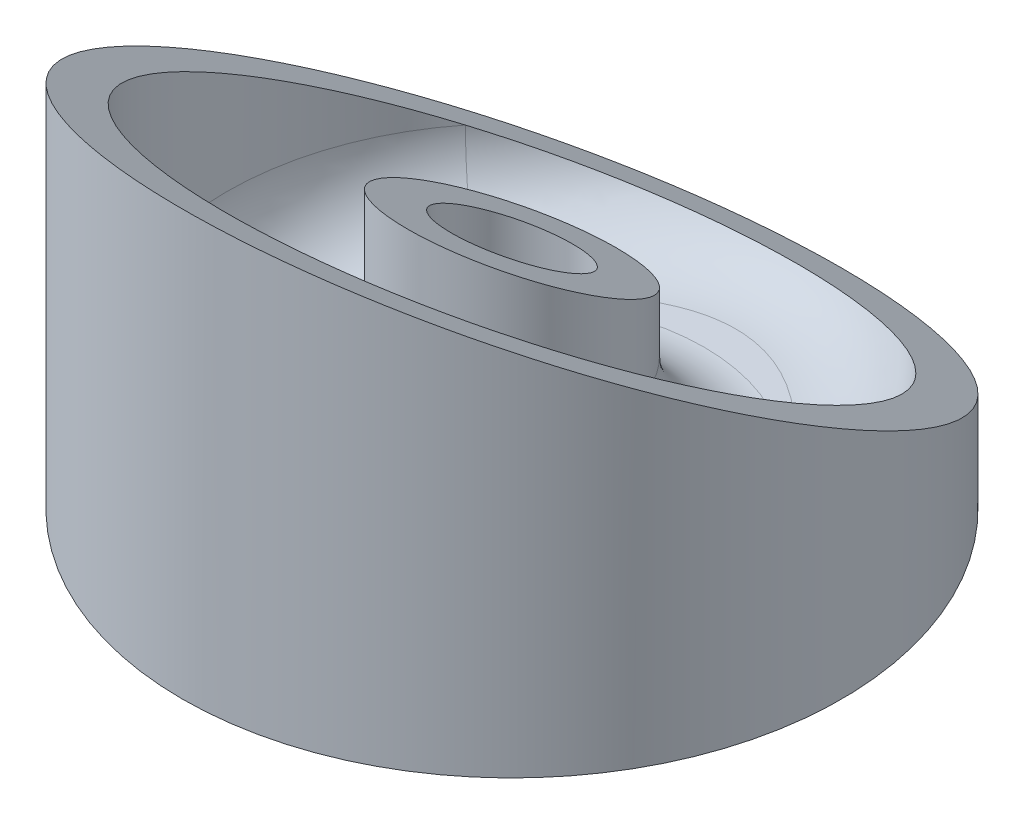
ISO-10303-21;
HEADER;
FILE_DESCRIPTION(('STEP AP214'),'2;1');
FILE_NAME('part.step','',(''),(''),'','','');
FILE_SCHEMA(('AUTOMOTIVE_DESIGN { 1 0 10303 214 1 1 1 1 }'));
ENDSEC;
DATA;
#1=APPLICATION_CONTEXT('core data for automotive mechanical design processes');
#2=APPLICATION_PROTOCOL_DEFINITION('international standard','automotive_design',2000,#1);
#3=PRODUCT_CONTEXT('',#1,'mechanical');
#4=PRODUCT('Part','Part','',(#3));
#5=PRODUCT_RELATED_PRODUCT_CATEGORY('part','',(#4));
#6=PRODUCT_DEFINITION_FORMATION('','',#4);
#7=PRODUCT_DEFINITION_CONTEXT('part definition',#1,'design');
#8=PRODUCT_DEFINITION('design','',#6,#7);
#9=PRODUCT_DEFINITION_SHAPE('','',#8);
#10=(LENGTH_UNIT() NAMED_UNIT(*) SI_UNIT(.MILLI.,.METRE.));
#11=(NAMED_UNIT(*) PLANE_ANGLE_UNIT() SI_UNIT($,.RADIAN.));
#12=(NAMED_UNIT(*) SI_UNIT($,.STERADIAN.) SOLID_ANGLE_UNIT());
#13=UNCERTAINTY_MEASURE_WITH_UNIT(LENGTH_MEASURE(1.E-05),#10,'distance_accuracy_value','');
#14=(GEOMETRIC_REPRESENTATION_CONTEXT(3) GLOBAL_UNCERTAINTY_ASSIGNED_CONTEXT((#13)) GLOBAL_UNIT_ASSIGNED_CONTEXT((#10,
#11,#12)) REPRESENTATION_CONTEXT('',''));
#15=CARTESIAN_POINT('',(0.,0.,0.));
#16=DIRECTION('',(0.,0.,1.));
#17=DIRECTION('',(1.,0.,0.));
#18=AXIS2_PLACEMENT_3D('',#15,#16,#17);
#19=CARTESIAN_POINT('',(0.,6.4951905283833,-3.75000000000002));
#20=DIRECTION('',(0.,-0.866025403784438,0.500000000000001));
#21=DIRECTION('',(0.,-0.500000000000001,-0.866025403784438));
#22=AXIS2_PLACEMENT_3D('',#19,#20,#21);
#23=PLANE('',#22);
#24=CARTESIAN_POINT('',(0.,8.66025403784441,0.));
#25=DIRECTION('',(0.,-0.866025403784438,0.500000000000001));
#26=DIRECTION('',(0.,-0.500000000000001,-0.866025403784438));
#27=AXIS2_PLACEMENT_3D('',#24,#25,#26);
#28=ELLIPSE('',#27,3.17542648054294,2.75);
#29=CARTESIAN_POINT('',(0.,7.07254079757294,-2.75));
#30=VERTEX_POINT('',#29);
#31=EDGE_CURVE('E106',#30,#30,#28,.T.);
#32=ORIENTED_EDGE('',*,*,#31,.T.);
#33=EDGE_LOOP('',(#32));
#34=FACE_BOUND('',#33,.T.);
#35=CARTESIAN_POINT('',(0.,8.66025403784441,0.));
#36=DIRECTION('',(0.,-0.866025403784438,0.500000000000001));
#37=DIRECTION('',(0.,-0.500000000000001,-0.866025403784438));
#38=AXIS2_PLACEMENT_3D('',#35,#36,#37);
#39=ELLIPSE('',#38,5.48482755730145,4.75);
#40=CARTESIAN_POINT('',(0.,5.91784025919368,-4.75));
#41=VERTEX_POINT('',#40);
#42=EDGE_CURVE('E94',#41,#41,#39,.T.);
#43=ORIENTED_EDGE('',*,*,#42,.F.);
#44=EDGE_LOOP('',(#43));
#45=FACE_BOUND('',#44,.T.);
#46=ADVANCED_FACE('F39',(#34,#45),#23,.F.);
#47=CARTESIAN_POINT('',(0.,30.,0.));
#48=DIRECTION('',(0.,-1.,0.));
#49=DIRECTION('',(0.,0.,-1.));
#50=AXIS2_PLACEMENT_3D('',#47,#48,#49);
#51=CYLINDRICAL_SURFACE('',#50,15.);
#52=CARTESIAN_POINT('',(0.,8.66025403784441,0.));
#53=DIRECTION('',(0.,-0.866025403784438,0.500000000000001));
#54=DIRECTION('',(0.,-0.500000000000001,-0.866025403784438));
#55=AXIS2_PLACEMENT_3D('',#52,#53,#54);
#56=ELLIPSE('',#55,17.3205080756888,15.);
#57=CARTESIAN_POINT('',(0.,0.,-15.));
#58=VERTEX_POINT('',#57);
#59=EDGE_CURVE('E88',#58,#58,#56,.T.);
#60=ORIENTED_EDGE('',*,*,#59,.T.);
#61=EDGE_LOOP('',(#60));
#62=FACE_BOUND('',#61,.T.);
#63=CARTESIAN_POINT('',(0.,-2.,0.));
#64=DIRECTION('',(0.,-1.,0.));
#65=DIRECTION('',(0.,0.,-1.));
#66=AXIS2_PLACEMENT_3D('',#63,#64,#65);
#67=CIRCLE('',#66,15.);
#68=CARTESIAN_POINT('',(0.,-2.,-15.));
#69=VERTEX_POINT('',#68);
#70=EDGE_CURVE('E99',#69,#69,#67,.T.);
#71=ORIENTED_EDGE('',*,*,#70,.F.);
#72=EDGE_LOOP('',(#71));
#73=FACE_BOUND('',#72,.T.);
#74=ADVANCED_FACE('F127',(#62,#73),#51,.T.);
#75=CARTESIAN_POINT('',(0.,30.,0.));
#76=DIRECTION('',(0.,-1.,0.));
#77=DIRECTION('',(0.,0.,-1.));
#78=AXIS2_PLACEMENT_3D('',#75,#76,#77);
#79=CYLINDRICAL_SURFACE('',#78,2.75);
#80=ORIENTED_EDGE('',*,*,#31,.F.);
#81=EDGE_LOOP('',(#80));
#82=FACE_BOUND('',#81,.T.);
#83=CARTESIAN_POINT('',(0.,-2.,0.));
#84=DIRECTION('',(0.,-1.,0.));
#85=DIRECTION('',(0.,0.,-1.));
#86=AXIS2_PLACEMENT_3D('',#83,#84,#85);
#87=CIRCLE('',#86,2.75);
#88=CARTESIAN_POINT('',(0.,-2.,-2.75));
#89=VERTEX_POINT('',#88);
#90=EDGE_CURVE('E97',#89,#89,#87,.T.);
#91=ORIENTED_EDGE('',*,*,#90,.T.);
#92=EDGE_LOOP('',(#91));
#93=FACE_BOUND('',#92,.T.);
#94=ADVANCED_FACE('F145',(#82,#93),#79,.F.);
#95=CARTESIAN_POINT('',(0.,8.66025403784441,0.));
#96=DIRECTION('',(0.,-0.866025403784438,0.500000000000001));
#97=DIRECTION('',(0.,-0.500000000000001,-0.866025403784438));
#98=AXIS2_PLACEMENT_3D('',#95,#96,#97);
#99=ELLIPSE('',#98,15.0111069989303,13.);
#100=CARTESIAN_POINT('',(10.1904905136242,4.,-8.07179676972452));
#101=VERTEX_POINT('',#100);
#102=CARTESIAN_POINT('',(-10.1904905136242,4.,-8.07179676972452));
#103=VERTEX_POINT('',#102);
#104=EDGE_CURVE('E93',#101,#103,#99,.T.);
#105=ORIENTED_EDGE('',*,*,#104,.T.);
#106=EDGE_CURVE('E78',#103,#101,#99,.T.);
#107=ORIENTED_EDGE('',*,*,#106,.T.);
#108=EDGE_LOOP('',(#105,#107));
#109=FACE_BOUND('',#108,.T.);
#110=ORIENTED_EDGE('',*,*,#59,.F.);
#111=EDGE_LOOP('',(#110));
#112=FACE_BOUND('',#111,.T.);
#113=ADVANCED_FACE('F91',(#109,#112),#23,.F.);
#114=CARTESIAN_POINT('',(0.,-2.,0.));
#115=DIRECTION('',(0.,-1.,0.));
#116=DIRECTION('',(0.,0.,-1.));
#117=AXIS2_PLACEMENT_3D('',#114,#115,#116);
#118=PLANE('',#117);
#119=ORIENTED_EDGE('',*,*,#70,.T.);
#120=EDGE_LOOP('',(#119));
#121=FACE_BOUND('',#120,.T.);
#122=ORIENTED_EDGE('',*,*,#90,.F.);
#123=EDGE_LOOP('',(#122));
#124=FACE_BOUND('',#123,.T.);
#125=ADVANCED_FACE('F144',(#121,#124),#118,.T.);
#126=CARTESIAN_POINT('',(0.,30.,0.));
#127=DIRECTION('',(0.,-1.,0.));
#128=DIRECTION('',(0.,0.,-1.));
#129=AXIS2_PLACEMENT_3D('',#126,#127,#128);
#130=CYLINDRICAL_SURFACE('',#129,13.);
#131=ORIENTED_EDGE('',*,*,#104,.F.);
#132=CARTESIAN_POINT('',(0.,4.,0.));
#133=DIRECTION('',(0.,-1.,0.));
#134=DIRECTION('',(0.,0.,-1.));
#135=AXIS2_PLACEMENT_3D('',#132,#133,#134);
#136=CIRCLE('',#135,13.);
#137=EDGE_CURVE('E82',#101,#103,#136,.T.);
#138=ORIENTED_EDGE('',*,*,#137,.T.);
#139=EDGE_LOOP('',(#131,#138));
#140=FACE_BOUND('',#139,.T.);
#141=ADVANCED_FACE('F96',(#140),#130,.F.);
#142=CARTESIAN_POINT('',(0.,30.,0.));
#143=DIRECTION('',(0.,-1.,0.));
#144=DIRECTION('',(0.,0.,-1.));
#145=AXIS2_PLACEMENT_3D('',#142,#143,#144);
#146=CYLINDRICAL_SURFACE('',#145,4.75);
#147=CARTESIAN_POINT('',(0.,4.,0.));
#148=DIRECTION('',(0.,-1.,0.));
#149=DIRECTION('',(0.,0.,-1.));
#150=AXIS2_PLACEMENT_3D('',#147,#148,#149);
#151=CIRCLE('',#150,4.75);
#152=CARTESIAN_POINT('',(0.,4.,-4.75));
#153=VERTEX_POINT('',#152);
#154=EDGE_CURVE('E11',#153,#153,#151,.F.);
#155=ORIENTED_EDGE('',*,*,#154,.T.);
#156=EDGE_LOOP('',(#155));
#157=FACE_BOUND('',#156,.T.);
#158=ORIENTED_EDGE('',*,*,#42,.T.);
#159=EDGE_LOOP('',(#158));
#160=FACE_BOUND('',#159,.T.);
#161=ADVANCED_FACE('F161',(#157,#160),#146,.T.);
#162=CARTESIAN_POINT('',(0.,0.,0.));
#163=DIRECTION('',(0.,-1.,0.));
#164=DIRECTION('',(0.,0.,-1.));
#165=AXIS2_PLACEMENT_3D('',#162,#163,#164);
#166=PLANE('',#165);
#167=CARTESIAN_POINT('',(-12.5084609325171,6.61587922715915,-3.54096104182087));
#168=CARTESIAN_POINT('',(-13.7066323093633,4.67239332511687,-4.71862935276788));
#169=CARTESIAN_POINT('',(-12.9445476095323,2.33619666255843,-3.96958541916062));
#170=CARTESIAN_POINT('',(-12.1824629097013,0.,-3.22054148555336));
#171=CARTESIAN_POINT('',(-10.3503119993591,0.,-1.41974227629329));
#172=CARTESIAN_POINT('',(-12.492600211395,6.58352991639473,-3.59699169165468));
#173=CARTESIAN_POINT('',(-13.6784214067288,4.63357306208912,-4.74349322547764));
#174=CARTESIAN_POINT('',(-12.9058364109555,2.31675304493473,-3.99627379406178));
#175=CARTESIAN_POINT('',(-12.1333869283313,0.,-3.24896024417785));
#176=CARTESIAN_POINT('',(-10.2974472824188,0.,-1.47353297002618));
#177=CARTESIAN_POINT('',(-12.4761175765105,6.55074466157421,-3.65377741874292));
#178=CARTESIAN_POINT('',(-13.6483924728007,4.59484411673742,-4.77031743107646));
#179=CARTESIAN_POINT('',(-12.865897853487,2.29738951901164,-4.0248090167118));
#180=CARTESIAN_POINT('',(-12.0835421280175,0.,-3.27919816955838));
#181=CARTESIAN_POINT('',(-10.24522983799,0.,-1.52795144878105));
#182=CARTESIAN_POINT('',(-12.4418834584057,6.48439200178271,-3.76870359671913));
#183=CARTESIAN_POINT('',(-13.5852232901905,4.51777423504316,-4.82746763101359));
#184=CARTESIAN_POINT('',(-12.7839315669741,2.25885477728261,-4.08521849402005));
#185=CARTESIAN_POINT('',(-11.9827769590749,0.,-3.34286836973659));
#186=CARTESIAN_POINT('',(-10.1419594749947,0.,-1.63787079231418));
#187=CARTESIAN_POINT('',(-12.4241321314861,6.45082469350167,-3.82684388013521));
#188=CARTESIAN_POINT('',(-13.5520923100268,4.479430054031,-4.85778285068083));
#189=CARTESIAN_POINT('',(-12.7419040954741,2.23968353811798,-4.1170923375902));
#190=CARTESIAN_POINT('',(-11.9318578537544,0.,-3.37629109952359));
#191=CARTESIAN_POINT('',(-10.0909064139968,0.,-1.69337152315026));
#192=CARTESIAN_POINT('',(-12.368952284306,6.34911043604419,-4.00301814190571));
#193=CARTESIAN_POINT('',(-13.448887829401,4.36529194219054,-4.95327542836214));
#194=CARTESIAN_POINT('',(-12.6132701108668,2.18252079563616,-4.21716286124354));
#195=CARTESIAN_POINT('',(-11.7782152563617,0.,-3.48061296730111));
#196=CARTESIAN_POINT('',(-9.93933663647443,0.,-1.86119432084426));
#197=CARTESIAN_POINT('',(-12.3295800572065,6.27991445049812,-4.12286910455132));
#198=CARTESIAN_POINT('',(-13.3746711877331,4.28995142512767,-5.02329169578192));
#199=CARTESIAN_POINT('',(-12.524067522661,2.14485825600119,-4.28983944953903));
#200=CARTESIAN_POINT('',(-11.6740431984455,0.,-3.55589805472792));
#201=CARTESIAN_POINT('',(-9.84034997013101,0.,-1.97489807814864));
#202=CARTESIAN_POINT('',(-12.2455055990914,6.13939768260195,-4.36625128586283));
#203=CARTESIAN_POINT('',(-13.2180003387895,4.14143426342588,-5.17343854148884));
#204=CARTESIAN_POINT('',(-12.3407446067735,2.07060062673868,-4.44462263215467));
#205=CARTESIAN_POINT('',(-11.4640647105165,0.,-3.71532053280891));
#206=CARTESIAN_POINT('',(-9.64568240649957,0.,-2.20478882072608));
#207=CARTESIAN_POINT('',(-12.2008114200435,6.06808022960055,-4.48977673792767));
#208=CARTESIAN_POINT('',(-13.1355935409713,4.06822540543837,-5.25350651094694));
#209=CARTESIAN_POINT('',(-12.2466318263082,2.03400402621891,-4.52671497394923));
#210=CARTESIAN_POINT('',(-11.358249049904,0.,-3.79940604465781));
#211=CARTESIAN_POINT('',(-9.54999679074786,0.,-2.32097184171559));
#212=CARTESIAN_POINT('',(-12.1058273711496,5.92365967463488,-4.7399204767855));
#213=CARTESIAN_POINT('',(-12.9639377370351,3.92395224628516,-5.42185537171379));
#214=CARTESIAN_POINT('',(-12.0544444806999,1.96186805571727,-4.69849417742624));
#215=CARTESIAN_POINT('',(-11.1455271997952,0.,-3.97461810103658));
#216=CARTESIAN_POINT('',(-9.36096893859339,0.,-2.55525264940239));
#217=CARTESIAN_POINT('',(-12.0555366133676,5.85055629076033,-4.86653925186144));
#218=CARTESIAN_POINT('',(-12.8747086340406,3.85285874870448,-5.51010800356786));
#219=CARTESIAN_POINT('',(-11.9563692884693,1.92632885463601,-4.78818224368225));
#220=CARTESIAN_POINT('',(-11.0386026977905,0.,-4.06572399813222));
#221=CARTESIAN_POINT('',(-9.26762707693104,0.,-2.67335073739192));
#222=CARTESIAN_POINT('',(-11.9490274277797,5.70277727993901,-5.12250000689623));
#223=CARTESIAN_POINT('',(-12.6901747916003,3.71269513222434,-5.69338848187879));
#224=CARTESIAN_POINT('',(-11.7566820714042,1.85624708252294,-4.97378612969785));
#225=CARTESIAN_POINT('',(-10.8237620519948,0.,-4.25365159258937));
#226=CARTESIAN_POINT('',(-9.08239912136794,0.,-2.91114287380126));
#227=CARTESIAN_POINT('',(-11.8927947826838,5.62809824057575,-5.25184789733383));
#228=CARTESIAN_POINT('',(-12.5948670738085,3.64360098259338,-5.78841685700229));
#229=CARTESIAN_POINT('',(-11.6550619719795,1.82170716581052,-5.06971666540133));
#230=CARTESIAN_POINT('',(-10.7158224965899,0.,-4.3504778695003));
#231=CARTESIAN_POINT('',(-8.99051715316,0.,-3.03084012279011));
#232=CARTESIAN_POINT('',(-11.7742965535149,5.47767498734249,-5.51238861457363));
#233=CARTESIAN_POINT('',(-12.3989914470364,3.50761136836658,-5.98369473440056));
#234=CARTESIAN_POINT('',(-11.4488708795508,1.75371295714688,-5.26631825484213));
#235=CARTESIAN_POINT('',(-10.4993130846974,0.,-4.54840446381347));
#236=CARTESIAN_POINT('',(-8.80785587251811,0.,-3.27107434241793));
#237=CARTESIAN_POINT('',(-11.7120308531902,5.40193075297115,-5.6435814768852));
#238=CARTESIAN_POINT('',(-12.2984306407829,3.44068910101976,-6.08393728043878));
#239=CARTESIAN_POINT('',(-11.344299829712,1.72025868613169,-5.36698939990768));
#240=CARTESIAN_POINT('',(-10.3907229611124,0.,-4.64950325174152));
#241=CARTESIAN_POINT('',(-8.71707658136974,0.,-3.39161132919637));
#242=CARTESIAN_POINT('',(-11.5158334760005,5.17350577360808,-6.03922514685991));
#243=CARTESIAN_POINT('',(-11.9902122826125,3.24365631410107,-6.39001607639306));
#244=CARTESIAN_POINT('',(-11.02638345209,1.62148606341403,-5.67452856535003));
#245=CARTESIAN_POINT('',(-10.0647544029123,0.,-4.956917854169));
#246=CARTESIAN_POINT('',(-8.4455427772033,0.,-3.75395788518518));
#247=CARTESIAN_POINT('',(-11.3725397460666,5.0196866491751,-6.30564768555358));
#248=CARTESIAN_POINT('',(-11.774497408832,3.11615300847242,-6.60273651673994));
#249=CARTESIAN_POINT('',(-10.8089074577594,1.55778323606111,-5.88685352918203));
#250=CARTESIAN_POINT('',(-9.84543789993614,0.,-5.16891611963567));
#251=CARTESIAN_POINT('',(-8.26565854181881,0.,-3.9964164411015));
#252=CARTESIAN_POINT('',(-11.050542135425,4.7024507478474,-6.85511638463807));
#253=CARTESIAN_POINT('',(-11.3125192729123,2.86281385944118,-7.04925993879641));
#254=CARTESIAN_POINT('',(-10.3504594278635,1.43108291034604,-6.33157783865554));
#255=CARTESIAN_POINT('',(-9.39074642155199,0.,-5.61161654000814));
#256=CARTESIAN_POINT('',(-7.89451903216769,0.,-4.49419240929748));
#257=CARTESIAN_POINT('',(-10.8702922514875,4.53898385459976,-7.13824934909841));
#258=CARTESIAN_POINT('',(-11.0650808511022,2.73720834289702,-7.28379775942673));
#259=CARTESIAN_POINT('',(-10.1088542632451,1.36832975569606,-6.56443302495853));
#260=CARTESIAN_POINT('',(-9.15488007725811,0.,-5.84294285045877));
#261=CARTESIAN_POINT('',(-7.70319682054452,0.,-4.74946026403184));
#262=CARTESIAN_POINT('',(-10.4783813301132,4.21348017542109,-7.70203825948647));
#263=CARTESIAN_POINT('',(-10.5502794611519,2.49538471217483,-7.75626841214076));
#264=CARTESIAN_POINT('',(-9.61254474950107,1.24742063270119,-7.03298316090918));
#265=CARTESIAN_POINT('',(-8.67704123155968,0.,-6.30759053760705));
#266=CARTESIAN_POINT('',(-7.31594457846777,0.,-5.25648972341927));
#267=CARTESIAN_POINT('',(-10.2667217068977,4.05144332545028,-7.98269431633434));
#268=CARTESIAN_POINT('',(-10.2828897193413,2.3789853225212,-7.99435981935214));
#269=CARTESIAN_POINT('',(-9.35784099047604,1.18926445755821,-7.26867798226369));
#270=CARTESIAN_POINT('',(-8.43493240326219,0.,-6.54107995580049));
#271=CARTESIAN_POINT('',(-7.12001475580564,0.,-5.50825148537597));
#272=CARTESIAN_POINT('',(-9.81076150385996,3.73151320603724,-8.53682953802929));
#273=CARTESIAN_POINT('',(-9.72807964225643,2.15576734999661,-8.46803932541986));
#274=CARTESIAN_POINT('',(-8.83440043178772,1.07765836790856,-7.73757100102009));
#275=CARTESIAN_POINT('',(-7.94283507147598,0.,-7.00520819034311));
#276=CARTESIAN_POINT('',(-6.72102565906969,0.,-6.00530857021783));
#277=CARTESIAN_POINT('',(-9.56652485637875,3.57361252761431,-8.81032153560741));
#278=CARTESIAN_POINT('',(-9.44065785698492,2.04877241161922,-8.70382401511837));
#279=CARTESIAN_POINT('',(-8.56569173056463,1.02419956727101,-7.97077314592824));
#280=CARTESIAN_POINT('',(-7.69274676477911,0.,-7.23604359707522));
#281=CARTESIAN_POINT('',(-6.51798090927812,0.,-6.25061545965951));
#282=CARTESIAN_POINT('',(-9.04369968682547,3.26421868798009,-9.34620738540268));
#283=CARTESIAN_POINT('',(-8.84442167319096,1.84434115793308,-9.1683438009094));
#284=CARTESIAN_POINT('',(-8.01222303058424,0.921985508394423,-8.43062723138662));
#285=CARTESIAN_POINT('',(-7.18202868798057,0.,-7.69124475860338));
#286=CARTESIAN_POINT('',(-6.10181716285181,0.,-6.73250506671352));
#287=CARTESIAN_POINT('',(-8.76511894765957,3.1127240854648,-9.60860373403163));
#288=CARTESIAN_POINT('',(-8.53554653915483,1.74675824929689,-9.39730277867702));
#289=CARTESIAN_POINT('',(-7.72746667638656,0.873229188947301,-8.65728064166383));
#290=CARTESIAN_POINT('',(-6.92128895208657,0.,-7.9158266391255));
#291=CARTESIAN_POINT('',(-5.88870045540534,0.,-6.96908974518588));
#292=CARTESIAN_POINT('',(-8.17525912278626,2.82031126900908,-10.1150775889172));
#293=CARTESIAN_POINT('',(-7.8982978719363,1.56244159895161,-9.84119647331757));
#294=CARTESIAN_POINT('',(-7.14296090353038,0.78107472755713,-9.09748574941141));
#295=CARTESIAN_POINT('',(-6.38947675915306,0.,-8.35237895081493));
#296=CARTESIAN_POINT('',(-5.45194263494951,0.,-7.4281830246049));
#297=CARTESIAN_POINT('',(-7.86431518600407,2.67930637892392,-10.3593052226604));
#298=CARTESIAN_POINT('',(-7.57006498778953,1.47548960194127,-10.0564667408699));
#299=CARTESIAN_POINT('',(-6.84337928139939,0.737630156381696,-9.31114131238392));
#300=CARTESIAN_POINT('',(-6.11842840680139,0.,-8.56466083906416));
#301=CARTESIAN_POINT('',(-5.2284204969786,0.,-7.65080383824504));
#302=CARTESIAN_POINT('',(-7.20678934344992,2.40925161570493,-10.8270537933817));
#303=CARTESIAN_POINT('',(-6.89032995365746,1.31197923101577,-10.4704094359475));
#304=CARTESIAN_POINT('',(-6.22500602794298,0.655875461999033,-9.72305749330934));
#305=CARTESIAN_POINT('',(-5.56140842287464,0.,-8.97455502522762));
#306=CARTESIAN_POINT('',(-4.76653525804536,0.,-8.08062904153915));
#307=CARTESIAN_POINT('',(-6.86017858298186,2.28021158521831,-11.0505576823947));
#308=CARTESIAN_POINT('',(-6.53868026039896,1.23530924541767,-10.6693181761247));
#309=CARTESIAN_POINT('',(-5.90619893076963,0.617569554637244,-9.92130541516747));
#310=CARTESIAN_POINT('',(-5.27529615316352,0.,-9.17239291850471));
#311=CARTESIAN_POINT('',(-4.5281602034553,0.,-8.28782071162129));
#312=CARTESIAN_POINT('',(-6.13664617451,2.03923781188481,-11.4679365010999));
#313=CARTESIAN_POINT('',(-5.81659834296779,1.09429759849587,-11.0422715233328));
#314=CARTESIAN_POINT('',(-5.25272479879785,0.547066327657755,-10.2942672912503));
#315=CARTESIAN_POINT('',(-4.69037848526484,0.,-9.54539023125861));
#316=CARTESIAN_POINT('',(-4.03793830954437,0.,-8.6788973798076));
#317=CARTESIAN_POINT('',(-5.76018556793717,1.92710056107644,-11.6621639169211));
#318=CARTESIAN_POINT('',(-5.44632877612985,1.02970399785362,-11.2168451548211));
#319=CARTESIAN_POINT('',(-4.91832299896845,0.514794978816184,-10.4692576034605));
#320=CARTESIAN_POINT('',(-4.39166012554977,0.,-9.72103992153387));
#321=CARTESIAN_POINT('',(-3.7863111048635,0.,-8.86305417084357));
#322=CARTESIAN_POINT('',(-4.97526880565384,1.72166025479338,-12.0179969653259));
#323=CARTESIAN_POINT('',(-4.68372948587186,0.912791444455125,-11.5379604903183));
#324=CARTESIAN_POINT('',(-4.22991705176455,0.456339057370429,-10.7923892496616));
#325=CARTESIAN_POINT('',(-3.77743933466812,0.,-10.0461912892577));
#326=CARTESIAN_POINT('',(-3.26581199412654,0.,-9.20463949043849));
#327=CARTESIAN_POINT('',(-4.56685487832819,1.62833290552807,-12.1796446759892));
#328=CARTESIAN_POINT('',(-4.29120460333121,0.860361712030906,-11.6847771198451));
#329=CARTESIAN_POINT('',(-3.87593895130976,0.430146626868446,-10.9405651899518));
#330=CARTESIAN_POINT('',(-3.46177463517434,0.,-10.1959597984235));
#331=CARTESIAN_POINT('',(-2.99696293032082,0.,-9.36210245288381));
#332=CARTESIAN_POINT('',(-3.69373379908545,1.45884108181809,-12.4732131261223));
#333=CARTESIAN_POINT('',(-3.45935883314367,0.766016308878896,-11.9523770893514));
#334=CARTESIAN_POINT('',(-3.12533495240484,0.382969024457122,-11.2117599138406));
#335=CARTESIAN_POINT('',(-2.79254331627455,0.,-10.4706928040813));
#336=CARTESIAN_POINT('',(-2.42369144700223,0.,-9.65169332590669));
#337=CARTESIAN_POINT('',(-3.2270983603453,1.38414604470207,-12.6025887254805));
#338=CARTESIAN_POINT('',(-3.01822092446358,0.72487783871365,-12.0711914467819));
#339=CARTESIAN_POINT('',(-2.72742851187727,0.362421091255129,-11.3325787710444));
#340=CARTESIAN_POINT('',(-2.43749909954125,0.,-10.593755357942));
#341=CARTESIAN_POINT('',(-2.11809402814185,0.,-9.78157241285627));
#342=CARTESIAN_POINT('',(-2.5086361061734,1.29440586150881,-12.7580232822518));
#343=CARTESIAN_POINT('',(-2.34251367753272,0.675732893564652,-12.2143940131647));
#344=CARTESIAN_POINT('',(-2.11757253526681,0.337862220402433,-11.4786506545355));
#345=CARTESIAN_POINT('',(-1.89285250659358,0.,-10.7428563508103));
#346=CARTESIAN_POINT('',(-1.647249100624,0.,-9.9392399843593));
#347=CARTESIAN_POINT('',(-2.26590047755179,1.26819978908395,-12.8034135311585));
#348=CARTESIAN_POINT('',(-2.11488758096795,0.661439039452824,-12.2563089705457));
#349=CARTESIAN_POINT('',(-1.91198366662666,0.330717171895376,-11.5214982325089));
#350=CARTESIAN_POINT('',(-1.70924446890945,0.,-10.7866590509664));
#351=CARTESIAN_POINT('',(-1.48811879450067,0.,-9.9856219918258));
#352=CARTESIAN_POINT('',(-1.77564920373889,1.22366622381599,-12.8805479288448));
#353=CARTESIAN_POINT('',(-1.65604087652368,0.637205153639173,-12.3276262006184));
#354=CARTESIAN_POINT('',(-1.49737417119229,0.318600142411183,-11.5945020131331));
#355=CARTESIAN_POINT('',(-1.33887002291968,0.,-10.8613486440215));
#356=CARTESIAN_POINT('',(-1.16653690966419,0.,-10.0647806372131));
#357=CARTESIAN_POINT('',(-1.52813579900822,1.20533512761601,-12.9122983188216));
#358=CARTESIAN_POINT('',(-1.42475998488705,0.627256276436632,-12.3570541306015));
#359=CARTESIAN_POINT('',(-1.28835515948254,0.313627167539764,-11.6246640201939));
#360=CARTESIAN_POINT('',(-1.15205527458506,0.,-10.8922621725051));
#361=CARTESIAN_POINT('',(-1.00408688567873,0.,-10.097563497466));
#362=CARTESIAN_POINT('',(-1.02812281181461,1.17679345783688,-12.9617339410119));
#363=CARTESIAN_POINT('',(-0.958115389473522,0.611787527889776,-12.4029011554131));
#364=CARTESIAN_POINT('',(-0.866466465871394,0.305892789943035,-11.6716990225357));
#365=CARTESIAN_POINT('',(-0.77492476189306,0.,-10.9404849741463));
#366=CARTESIAN_POINT('',(-0.675728851696041,0.,-10.1487366146358));
#367=CARTESIAN_POINT('',(-0.77560020517443,1.16664203722344,-12.9793167172834));
#368=CARTESIAN_POINT('',(-0.722665723601686,0.606295318379205,-12.4192390540032));
#369=CARTESIAN_POINT('',(-0.65357992148331,0.303147496151839,-11.6884752072056));
#370=CARTESIAN_POINT('',(-0.584538178886142,0.,-10.9577093695462));
#371=CARTESIAN_POINT('',(-0.50980440114224,0.,-10.1670220153014));
#372=CARTESIAN_POINT('',(-0.269194925911319,1.15488381594863,-12.999682553938));
#373=CARTESIAN_POINT('',(-0.25077491136271,0.599936841151557,-12.4381601284267));
#374=CARTESIAN_POINT('',(-0.226800859963146,0.299968255379335,-11.7079116909359));
#375=CARTESIAN_POINT('',(-0.202870872966343,0.,-10.9776612309475));
#376=CARTESIAN_POINT('',(-0.176970313591082,0.,-10.1882104793801));
#377=CARTESIAN_POINT('',(-0.01531226948501,1.15327691375736,-13.002465790176));
#378=CARTESIAN_POINT('',(-0.0142631475099377,0.599068608968831,-12.440749147609));
#379=CARTESIAN_POINT('',(-0.0129083548145806,0.299534280933866,-11.7105721577255));
#380=CARTESIAN_POINT('',(-0.0115330544656772,0.,-10.9803948570774));
#381=CARTESIAN_POINT('',(-0.0100606883236173,0.,-10.1911137255709));
#382=CARTESIAN_POINT('',(0.491869016569785,1.15864591147021,-12.9931664133517));
#383=CARTESIAN_POINT('',(0.458238314651335,0.601970929261114,-12.4321068381972));
#384=CARTESIAN_POINT('',(0.414447719424971,0.300985419806826,-11.701692679439));
#385=CARTESIAN_POINT('',(0.370676887201912,0.,-10.9712779946896));
#386=CARTESIAN_POINT('',(0.323330816584991,0.,-10.1814307556015));
#387=CARTESIAN_POINT('',(0.74516757587484,1.16562279578212,-12.9810820952449));
#388=CARTESIAN_POINT('',(0.694299072365674,0.605742888289668,-12.4208713197435));
#389=CARTESIAN_POINT('',(0.627911236506385,0.302870799113917,-11.690151105641));
#390=CARTESIAN_POINT('',(0.561606481781818,0.,-10.9594230852243));
#391=CARTESIAN_POINT('',(0.489812644971132,0.,-10.1688427628715));
#392=CARTESIAN_POINT('',(1.24915035988191,1.18800299522322,-12.9423184527294));
#393=CARTESIAN_POINT('',(1.16430955799965,0.617859822681084,-12.384892445158));
#394=CARTESIAN_POINT('',(1.05291011562688,0.308929363707054,-11.6532172760593));
#395=CARTESIAN_POINT('',(0.94159492213,0.,-10.9215353719647));
#396=CARTESIAN_POINT('',(0.820904700749124,0.,-10.1286224374493));
#397=CARTESIAN_POINT('',(1.49983458946976,1.20340629460167,-12.9156391556017));
#398=CARTESIAN_POINT('',(1.39832841865078,0.62620839439817,-12.3601384381262));
#399=CARTESIAN_POINT('',(1.26444548126933,0.313102544716717,-11.6278250461653));
#400=CARTESIAN_POINT('',(1.13070959518757,0.,-10.8954913704591));
#401=CARTESIAN_POINT('',(0.985514931638797,0.,-10.1009901328782));
#402=CARTESIAN_POINT('',(2.20609599231664,1.2587697656778,-12.8197468108145));
#403=CARTESIAN_POINT('',(2.0587307368054,0.656291823578939,-12.2713361921291));
#404=CARTESIAN_POINT('',(1.86113626992394,0.328139414021935,-11.5368685081314));
#405=CARTESIAN_POINT('',(1.66402818260835,0.,-10.802322754132));
#406=CARTESIAN_POINT('',(1.44897077067361,0.,-10.002226885546));
#407=CARTESIAN_POINT('',(2.65669723646704,1.30848788886775,-12.7336324953925));
#408=CARTESIAN_POINT('',(2.48135149586255,0.683394863862677,-12.1917057340943));
#409=CARTESIAN_POINT('',(2.24270239291741,0.341678227463422,-11.4554787683406));
#410=CARTESIAN_POINT('',(2.00488446198484,0.,-10.7190243187318));
#411=CARTESIAN_POINT('',(1.74429139311941,0.,-9.91405720941557));
#412=CARTESIAN_POINT('',(3.53395475761202,1.43263030841305,-12.5186115173655));
#413=CARTESIAN_POINT('',(3.30816970963451,0.75158219775478,-11.9941674138061));
#414=CARTESIAN_POINT('',(2.9891296096897,0.375772273070535,-11.2541993574872));
#415=CARTESIAN_POINT('',(2.67092356516744,0.,-10.5140097514306));
#416=CARTESIAN_POINT('',(2.31915610653915,0.,-9.69733906316285));
#417=CARTESIAN_POINT('',(3.960615664505,1.50704980830438,-12.3897131624799));
#418=CARTESIAN_POINT('',(3.71271345076092,0.792726693561415,-11.876089690871));
#419=CARTESIAN_POINT('',(3.35399393095178,0.396326143088361,-11.1343171609604));
#420=CARTESIAN_POINT('',(2.99638363833613,0.,-10.3921200011744));
#421=CARTESIAN_POINT('',(2.59870324805598,0.,-9.56879843245229));
#422=CARTESIAN_POINT('',(4.73826082623214,1.6674106865064,-12.1119599738876));
#423=CARTESIAN_POINT('',(4.45578129572556,0.882300120142154,-11.6233858119164));
#424=CARTESIAN_POINT('',(4.02452550933382,0.441120853635146,-10.8785274224686));
#425=CARTESIAN_POINT('',(3.59414817519563,0.,-10.1333352521256));
#426=CARTESIAN_POINT('',(3.10983533230549,0.,-9.2961742335101));
#427=CARTESIAN_POINT('',(5.09234598890865,1.75109639437341,-11.9670120759946));
#428=CARTESIAN_POINT('',(4.79691501401239,0.929452127424255,-11.4919442164911));
#429=CARTESIAN_POINT('',(4.33222025776269,0.464681604088617,-10.7459667474531));
#430=CARTESIAN_POINT('',(3.86855673700596,0.,-9.99949874388125));
#431=CARTESIAN_POINT('',(3.34326861804464,0.,-9.15549375848298));
#432=CARTESIAN_POINT('',(5.77583764771382,1.93266494577297,-11.6525261199139));
#433=CARTESIAN_POINT('',(5.46184471390864,1.03292646250479,-11.2083057731907));
#434=CARTESIAN_POINT('',(4.93251029061503,0.516418579043908,-10.4606554122743));
#435=CARTESIAN_POINT('',(4.40421251446165,0.,-9.71251274541661));
#436=CARTESIAN_POINT('',(3.79690903307249,0.,-8.85404842859439));
#437=CARTESIAN_POINT('',(6.10522480613439,2.03055874130285,-11.4829690923104));
#438=CARTESIAN_POINT('',(5.78577566102981,1.08932009128025,-11.0559320494803));
#439=CARTESIAN_POINT('',(5.22509368871949,0.544598366217978,-10.3078891852292));
#440=CARTESIAN_POINT('',(4.66557187023532,0.,-9.55919144229907));
#441=CARTESIAN_POINT('',(4.01710577238546,0.,-8.69326809356782));
#442=CARTESIAN_POINT('',(6.74028553669385,2.23885906282651,-11.1221823521985));
#443=CARTESIAN_POINT('',(6.4182277774719,1.21095396430257,-10.733338211103));
#444=CARTESIAN_POINT('',(5.79732028518096,0.605414127788474,-9.98515706138146));
#445=CARTESIAN_POINT('',(5.17759616767199,0.,-9.23630906174649));
#446=CARTESIAN_POINT('',(4.44656527987578,0.,-8.35470401159312));
#447=CARTESIAN_POINT('',(7.04576388568866,2.34935348154556,-10.9308004050243));
#448=CARTESIAN_POINT('',(6.72672374308622,1.2763271037294,-10.562831138921));
#449=CARTESIAN_POINT('',(6.07685067364283,0.638081775522034,-9.81507136252926));
#450=CARTESIAN_POINT('',(5.42826147795446,0.,-9.06647969420853));
#451=CARTESIAN_POINT('',(4.65573423185673,0.,-8.17680237255395));
#452=CARTESIAN_POINT('',(7.62984048996628,2.57993947736758,-10.5314137447467));
#453=CARTESIAN_POINT('',(7.32591218420088,1.41493181834173,-10.2087175714683));
#454=CARTESIAN_POINT('',(6.62126213773073,0.707383818205276,-9.46238695915622));
#455=CARTESIAN_POINT('',(5.91790278474625,0.,-8.71522036552436));
#456=CARTESIAN_POINT('',(5.06258436809083,0.,-7.8085444242623));
#457=CARTESIAN_POINT('',(7.90844743930875,2.7000279272399,-10.3234144481656));
#458=CARTESIAN_POINT('',(7.61670020113255,1.48823848531808,-10.0249501009386));
#459=CARTESIAN_POINT('',(6.88614793959584,0.744016921962096,-9.2797923347361));
#460=CARTESIAN_POINT('',(6.15696950592772,0.,-8.53363689102285));
#461=CARTESIAN_POINT('',(5.26026925964612,0.,-7.61819217699644));
#462=CARTESIAN_POINT('',(8.52792061118029,2.98921695805086,-9.82252435380945));
#463=CARTESIAN_POINT('',(8.27623407606258,1.66816176068355,-9.58413834245301));
#464=CARTESIAN_POINT('',(7.48871907867476,0.833897220897531,-8.84260911911757));
#465=CARTESIAN_POINT('',(6.70366411670467,0.,-8.09929630900682));
#466=CARTESIAN_POINT('',(5.71020718915798,0.,-7.16241513289452));
#467=CARTESIAN_POINT('',(8.85842481591021,3.16127174955139,-9.52451671324486));
#468=CARTESIAN_POINT('',(8.63786000481876,1.77767565289034,-9.32334429454172));
#469=CARTESIAN_POINT('',(7.82110565667047,0.888602030153369,-8.5843749014975));
#470=CARTESIAN_POINT('',(7.00697402852395,0.,-7.84325739863164));
#471=CARTESIAN_POINT('',(5.95858528331941,0.,-6.89318317005625));
#472=CARTESIAN_POINT('',(9.47381733611485,3.51453658370973,-8.91264407195522));
#473=CARTESIAN_POINT('',(9.33251987993229,2.00905732628682,-8.79184245524567));
#474=CARTESIAN_POINT('',(8.46439824415187,1.00429008865579,-8.05811350409016));
#475=CARTESIAN_POINT('',(7.59892943723755,0.,-7.32221689228181));
#476=CARTESIAN_POINT('',(6.44152049487395,0.,-6.3424129898604));
#477=CARTESIAN_POINT('',(9.75867300777353,3.69575305725032,-8.59876793261445));
#478=CARTESIAN_POINT('',(9.66563779659119,2.13114985816934,-8.52078447294158));
#479=CARTESIAN_POINT('',(8.77528879204047,1.06527778011743,-7.79007948308309));
#480=CARTESIAN_POINT('',(7.88773374064996,0.,-7.05687879741033));
#481=CARTESIAN_POINT('',(6.67606764650806,0.,-6.06086614751572));
#482=CARTESIAN_POINT('',(10.1501010679974,3.96926653503676,-8.12502869253348));
#483=CARTESIAN_POINT('',(10.139956416136,2.32125400103305,-8.11664356960599));
#484=CARTESIAN_POINT('',(9.22365767361503,1.16055586584164,-7.38907396080936));
#485=CARTESIAN_POINT('',(8.30802978907611,0.,-6.66090282659606));
#486=CARTESIAN_POINT('',(7.01769048913155,0.,-5.63592521939041));
#487=CARTESIAN_POINT('',(10.2733141105663,4.05961346893944,-7.96854321270598));
#488=CARTESIAN_POINT('',(10.2927020126067,2.38523359116848,-7.98341002423414));
#489=CARTESIAN_POINT('',(9.36846691626776,1.19253806781008,-7.25717361215943));
#490=CARTESIAN_POINT('',(8.44491880436994,0.,-6.53030213129891));
#491=CARTESIAN_POINT('',(7.12857905802198,0.,-5.49555927894556));
#492=CARTESIAN_POINT('',(10.509622254634,4.24110976008892,-7.65418241504977));
#493=CARTESIAN_POINT('',(10.5918337232972,2.5160539127208,-7.71728118060124));
#494=CARTESIAN_POINT('',(9.65376706620627,1.25794780175509,-6.99353748562098));
#495=CARTESIAN_POINT('',(8.71639070696068,0.,-6.26915616111202));
#496=CARTESIAN_POINT('',(7.34848209083711,0.,-5.21335893546943));
#497=CARTESIAN_POINT('',(10.6227170511023,4.33225914143584,-7.49630705547842));
#498=CARTESIAN_POINT('',(10.7382260463856,2.58292490325662,-7.58435439028203));
#499=CARTESIAN_POINT('',(9.79425784322133,1.29137537725969,-6.86180171281182));
#500=CARTESIAN_POINT('',(8.85099614530758,0.,-6.13857863407375));
#501=CARTESIAN_POINT('',(7.45749649818226,0.,-5.07152448831141));
#502=CARTESIAN_POINT('',(10.8388900346829,4.51477224850132,-7.18018508099376));
#503=CARTESIAN_POINT('',(11.0244781394138,2.71941023515163,-7.32007143508382));
#504=CARTESIAN_POINT('',(10.0709057546945,1.35961775777321,-6.59963145340287));
#505=CARTESIAN_POINT('',(9.11804114098646,0.,-5.87852161212196));
#506=CARTESIAN_POINT('',(7.67398182245018,0.,-4.78708350195131));
#507=CARTESIAN_POINT('',(10.9419855983106,4.60613530918849,-7.02193961794859));
#508=CARTESIAN_POINT('',(11.1643548779082,2.78905230276175,-7.18868465261438));
#509=CARTESIAN_POINT('',(10.2070701201274,1.39443000243652,-6.46919507611719));
#510=CARTESIAN_POINT('',(9.25050969568616,0.,-5.74901048930057));
#511=CARTESIAN_POINT('',(7.78145512999208,0.,-4.64447877389497));
#512=CARTESIAN_POINT('',(11.1386893515178,4.78880667196339,-6.70554353653461));
#513=CARTESIAN_POINT('',(11.4378204475149,2.93120921268235,-6.92838407494674));
#514=CARTESIAN_POINT('',(10.4754741256983,1.4655085119469,-6.21044436108043));
#515=CARTESIAN_POINT('',(9.5138553643897,0.,-5.49179996439714));
#516=CARTESIAN_POINT('',(7.99563191984126,0.,-4.35871433229103));
#517=CARTESIAN_POINT('',(11.2322985097163,4.88011497869352,-6.54739291012495));
#518=CARTESIAN_POINT('',(11.5714124157737,3.00375845524797,-6.79944855321266));
#519=CARTESIAN_POINT('',(10.6077141655564,1.50177462781618,-6.08212980780019));
#520=CARTESIAN_POINT('',(9.64475931720314,0.,-5.36407572196251));
#521=CARTESIAN_POINT('',(8.10233547970895,0.,-4.21555467695776));
#522=CARTESIAN_POINT('',(11.3213264462962,4.97119058413901,-6.38964533416326));
#523=CARTESIAN_POINT('',(11.7014811518319,3.07755392849369,-6.6726886040508));
#524=CARTESIAN_POINT('',(10.7380806270586,1.53877696424685,-5.95539106498982));
#525=CARTESIAN_POINT('',(9.77468010228528,0.,-5.23809352592884));
#526=CARTESIAN_POINT('',(8.2089536146352,0.,-4.07233564272834));
#527=(BOUNDED_SURFACE() B_SPLINE_SURFACE(3,2,((#167,#168,#169,#170,#171),(#172,#173,#174,#175,
#176),(#177,#178,#179,#180,#181),(#182,#183,#184,#185,#186),(#187,#188,#189,#190,#191),(#192,
#193,#194,#195,#196),(#197,#198,#199,#200,#201),(#202,#203,#204,#205,#206),(#207,#208,#209,#210,
#211),(#212,#213,#214,#215,#216),(#217,#218,#219,#220,#221),(#222,#223,#224,#225,#226),(#227,
#228,#229,#230,#231),(#232,#233,#234,#235,#236),(#237,#238,#239,#240,#241),(#242,#243,#244,#245,
#246),(#247,#248,#249,#250,#251),(#252,#253,#254,#255,#256),(#257,#258,#259,#260,#261),(#262,
#263,#264,#265,#266),(#267,#268,#269,#270,#271),(#272,#273,#274,#275,#276),(#277,#278,#279,#280,
#281),(#282,#283,#284,#285,#286),(#287,#288,#289,#290,#291),(#292,#293,#294,#295,#296),(#297,
#298,#299,#300,#301),(#302,#303,#304,#305,#306),(#307,#308,#309,#310,#311),(#312,#313,#314,#315,
#316),(#317,#318,#319,#320,#321),(#322,#323,#324,#325,#326),(#327,#328,#329,#330,#331),(#332,
#333,#334,#335,#336),(#337,#338,#339,#340,#341),(#342,#343,#344,#345,#346),(#347,#348,#349,#350,
#351),(#352,#353,#354,#355,#356),(#357,#358,#359,#360,#361),(#362,#363,#364,#365,#366),(#367,
#368,#369,#370,#371),(#372,#373,#374,#375,#376),(#377,#378,#379,#380,#381),(#382,#383,#384,#385,
#386),(#387,#388,#389,#390,#391),(#392,#393,#394,#395,#396),(#397,#398,#399,#400,#401),(#402,
#403,#404,#405,#406),(#407,#408,#409,#410,#411),(#412,#413,#414,#415,#416),(#417,#418,#419,#420,
#421),(#422,#423,#424,#425,#426),(#427,#428,#429,#430,#431),(#432,#433,#434,#435,#436),(#437,
#438,#439,#440,#441),(#442,#443,#444,#445,#446),(#447,#448,#449,#450,#451),(#452,#453,#454,#455,
#456),(#457,#458,#459,#460,#461),(#462,#463,#464,#465,#466),(#467,#468,#469,#470,#471),(#472,
#473,#474,#475,#476),(#477,#478,#479,#480,#481),(#482,#483,#484,#485,#486),(#487,#488,#489,#490,
#491),(#492,#493,#494,#495,#496),(#497,#498,#499,#500,#501),(#502,#503,#504,#505,#506),(#507,
#508,#509,#510,#511),(#512,#513,#514,#515,#516),(#517,#518,#519,#520,#521),(#522,#523,#524,#525,
#526)),.UNSPECIFIED.,.F.,.F.,.F.) B_SPLINE_SURFACE_WITH_KNOTS((4,2,2,2,2,2,2,2,2,2,2,2,2,2,2,2,
2,2,2,2,2,2,2,2,2,2,2,2,2,2,2,2,2,2,2,4),(3,2,3),(0.,0.226244327162952,0.452460829287761,
0.904638491007456,1.35614051118985,1.80771426771157,2.2603940913171,2.7130826394077,
3.61878676352722,4.57579334200419,5.53275684438954,6.48786920616417,7.44276552109535,
8.38860608931121,9.33521795611953,10.269321492081,11.2022107514462,12.1944437550634,
12.6912046985988,13.1877380962439,13.687830835036,14.1879176314831,14.6880617843465,
15.1882050023384,16.10893798127,17.0294922786003,17.8459123820086,18.6629651808714,
19.486112875903,20.308993347329,21.4072223981978,22.5062333346713,23.0428689347261,
23.5795207070619,24.1152225258681,24.6508695910669),(0.,0.5,1.),
.UNSPECIFIED.) GEOMETRIC_REPRESENTATION_ITEM() RATIONAL_B_SPLINE_SURFACE(((1.,0.841412750782989,
1.,0.841412750782989,1.),(1.,0.842857025094928,1.,0.842857025094928,1.),(1.,0.844291620368718,
1.,0.844291620368718,1.),(1.,0.847139408649922,1.,0.847139408649922,1.),(1.,0.848552604267831,
1.,0.848552604267831,1.),(1.,0.852755973577975,1.,0.852755973577975,1.),(1.,0.855511563955385,
1.,0.855511563955385,1.),(1.,0.860919407368317,1.,0.860919407368317,1.),(1.,0.863571808657782,
1.,0.863571808657782,1.),(1.,0.868776880121752,1.,0.868776880121752,1.),(1.,0.871329534383644,
1.,0.871329534383644,1.),(1.,0.87634206398835,1.,0.87634206398835,1.),(1.,0.878801696767797,1.,
0.878801696767797,1.),(1.,0.883624179477924,1.,0.883624179477924,1.),(1.,0.885987027542399,1.,
0.885987027542399,1.),(1.,0.892936583502571,1.,0.892936583502571,1.),(1.,0.897382494573678,1.,
0.897382494573678,1.),(1.,0.906164987670186,1.,0.906164987670186,1.),(1.,0.910481112134687,1.,
0.910481112134687,1.),(1.,0.918743423809827,1.,0.918743423809827,1.),(1.,0.922689627663071,1.,
0.922689627663071,1.),(1.,0.93021870620384,1.,0.93021870620384,1.),(1.,0.933802268945502,1.,
0.933802268945502,1.),(1.,0.940618636584129,1.,0.940618636584129,1.),(1.,0.943851520639317,1.,
0.943851520639317,1.),(1.,0.94993411184022,1.,0.94993411184022,1.),(1.,0.95278716208479,1.,
0.95278716208479,1.),(1.,0.958135022465587,1.,0.958135022465587,1.),(1.,0.960629538572808,1.,
0.960629538572808,1.),(1.,0.965205612821337,1.,0.965205612821337,1.),(1.,0.96729219214954,1.,
0.96729219214954,1.),(1.,0.971061875341641,1.,0.971061875341641,1.),(1.,0.972745500172608,1.,
0.972745500172608,1.),(1.,0.975772166604649,1.,0.975772166604649,1.),(1.,0.977086729788674,1.,
0.977086729788674,1.),(1.,0.978655959106978,1.,0.978655959106978,1.),(1.,0.97911209781776,1.,
0.97911209781776,1.),(1.,0.979885265993815,1.,0.979885265993815,1.),(1.,0.980202359083643,1.,
0.980202359083643,1.),(1.,0.980695397207408,1.,0.980695397207408,1.),(1.,0.980870314144089,1.,
0.980870314144089,1.),(1.,0.98107287109783,1.,0.98107287109783,1.),(1.,0.981100512864882,1.,
0.981100512864882,1.),(1.,0.981008065887829,1.,0.981008065887829,1.),(1.,0.980887960199715,1.,
0.980887960199715,1.),(1.,0.980501842795796,1.,0.980501842795796,1.),(1.,0.980235831352719,1.,
0.980235831352719,1.),(1.,0.979276763423906,1.,0.979276763423906,1.),(1.,0.978412705647006,1.,
0.978412705647006,1.),(1.,0.976232370798161,1.,0.976232370798161,1.),(1.,0.974916181518475,1.,
0.974916181518475,1.),(1.,0.972039976631179,1.,0.972039976631179,1.),(1.,0.97052438543506,1.,
0.97052438543506,1.),(1.,0.967186881554301,1.,0.967186881554301,1.),(1.,0.965364732392025,1.,
0.965364732392025,1.),(1.,0.961419343917064,1.,0.961419343917064,1.),(1.,0.959293959983881,1.,
0.959293959983881,1.),(1.,0.954768108385228,1.,0.954768108385228,1.),(1.,0.952367730245909,1.,
0.952367730245909,1.),(1.,0.946453532686019,1.,0.946453532686019,1.),(1.,0.942835902983959,1.,
0.942835902983959,1.),(1.,0.935135601148313,1.,0.935135601148313,1.),(1.,0.931052599760845,1.,
0.931052599760845,1.),(1.,0.924626924145486,1.,0.924626924145486,1.),(1.,0.922462830276414,1.,
0.922462830276414,1.),(1.,0.918020403173114,1.,0.918020403173114,1.),(1.,0.915742066498085,1.,
0.915742066498085,1.),(1.,0.911072570031012,1.,0.911072570031012,1.),(1.,0.908681617091684,1.,
0.908681617091684,1.),(1.,0.903779519432067,1.,0.903779519432067,1.),(1.,0.901268387021453,1.,
0.901268387021453,1.),(1.,0.898695098166861,1.,0.898695098166861,1.))) REPRESENTATION_ITEM('') SURFACE());
#528=CARTESIAN_POINT('',(8.2089536146352,0.,-4.07233564272834));
#529=CARTESIAN_POINT('',(8.10233547970895,0.,-4.21555467695776));
#530=CARTESIAN_POINT('',(7.99563191984126,0.,-4.35871433229103));
#531=CARTESIAN_POINT('',(7.78145512999208,0.,-4.64447877389497));
#532=CARTESIAN_POINT('',(7.67398182245018,0.,-4.78708350195131));
#533=CARTESIAN_POINT('',(7.45749649818226,0.,-5.07152448831141));
#534=CARTESIAN_POINT('',(7.34848209083711,0.,-5.21335893546943));
#535=CARTESIAN_POINT('',(7.12857905802198,0.,-5.49555927894556));
#536=CARTESIAN_POINT('',(7.01769048913155,0.,-5.63592521939041));
#537=CARTESIAN_POINT('',(6.67606764650807,0.,-6.06086614751572));
#538=CARTESIAN_POINT('',(6.44152049487395,0.,-6.3424129898604));
#539=CARTESIAN_POINT('',(5.95858528331941,0.,-6.89318317005625));
#540=CARTESIAN_POINT('',(5.71020718915798,0.,-7.16241513289452));
#541=CARTESIAN_POINT('',(5.26026925964612,0.,-7.61819217699644));
#542=CARTESIAN_POINT('',(5.06258436809083,0.,-7.8085444242623));
#543=CARTESIAN_POINT('',(4.65573423185673,0.,-8.17680237255395));
#544=CARTESIAN_POINT('',(4.44656527987578,0.,-8.35470401159312));
#545=CARTESIAN_POINT('',(4.01710577238546,0.,-8.69326809356781));
#546=CARTESIAN_POINT('',(3.79690903307249,0.,-8.85404842859439));
#547=CARTESIAN_POINT('',(3.34326861804464,0.,-9.15549375848298));
#548=CARTESIAN_POINT('',(3.10983533230549,0.,-9.2961742335101));
#549=CARTESIAN_POINT('',(2.59870324805598,0.,-9.56879843245229));
#550=CARTESIAN_POINT('',(2.31915610653915,0.,-9.69733906316285));
#551=CARTESIAN_POINT('',(1.74429139311941,0.,-9.91405720941557));
#552=CARTESIAN_POINT('',(1.44897077067361,0.,-10.002226885546));
#553=CARTESIAN_POINT('',(0.985514931638797,0.,-10.1009901328782));
#554=CARTESIAN_POINT('',(0.820904700749124,0.,-10.1286224374493));
#555=CARTESIAN_POINT('',(0.489812644971132,0.,-10.1688427628715));
#556=CARTESIAN_POINT('',(0.323330816584992,0.,-10.1814307556015));
#557=CARTESIAN_POINT('',(-0.010060688323617,0.,-10.1911137255709));
#558=CARTESIAN_POINT('',(-0.176970313591082,0.,-10.1882104793801));
#559=CARTESIAN_POINT('',(-0.50980440114224,0.,-10.1670220153014));
#560=CARTESIAN_POINT('',(-0.675728851696041,0.,-10.1487366146358));
#561=CARTESIAN_POINT('',(-1.00408688567873,0.,-10.097563497466));
#562=CARTESIAN_POINT('',(-1.16653690966419,0.,-10.0647806372131));
#563=CARTESIAN_POINT('',(-1.48811879450067,0.,-9.9856219918258));
#564=CARTESIAN_POINT('',(-1.647249100624,0.,-9.9392399843593));
#565=CARTESIAN_POINT('',(-2.11809402814185,0.,-9.78157241285627));
#566=CARTESIAN_POINT('',(-2.42369144700223,0.,-9.65169332590669));
#567=CARTESIAN_POINT('',(-2.99696293032082,0.,-9.36210245288381));
#568=CARTESIAN_POINT('',(-3.26581199412654,0.,-9.20463949043849));
#569=CARTESIAN_POINT('',(-3.7863111048635,0.,-8.86305417084357));
#570=CARTESIAN_POINT('',(-4.03793830954437,0.,-8.6788973798076));
#571=CARTESIAN_POINT('',(-4.5281602034553,0.,-8.28782071162129));
#572=CARTESIAN_POINT('',(-4.76653525804536,0.,-8.08062904153914));
#573=CARTESIAN_POINT('',(-5.2284204969786,0.,-7.65080383824504));
#574=CARTESIAN_POINT('',(-5.45194263494951,0.,-7.4281830246049));
#575=CARTESIAN_POINT('',(-5.88870045540534,0.,-6.96908974518588));
#576=CARTESIAN_POINT('',(-6.10181716285181,0.,-6.73250506671352));
#577=CARTESIAN_POINT('',(-6.51798090927812,0.,-6.25061545965951));
#578=CARTESIAN_POINT('',(-6.72102565906969,0.,-6.00530857021783));
#579=CARTESIAN_POINT('',(-7.12001475580564,0.,-5.50825148537597));
#580=CARTESIAN_POINT('',(-7.31594457846777,0.,-5.25648972341927));
#581=CARTESIAN_POINT('',(-7.70319682054452,0.,-4.74946026403184));
#582=CARTESIAN_POINT('',(-7.89451903216769,0.,-4.49419240929748));
#583=CARTESIAN_POINT('',(-8.26565854181881,0.,-3.9964164411015));
#584=CARTESIAN_POINT('',(-8.4455427772033,0.,-3.75395788518518));
#585=CARTESIAN_POINT('',(-8.71707658136974,0.,-3.39161132919637));
#586=CARTESIAN_POINT('',(-8.8078558725181,0.,-3.27107434241793));
#587=CARTESIAN_POINT('',(-8.99051715315999,0.,-3.03084012279011));
#588=CARTESIAN_POINT('',(-9.08239912136794,0.,-2.91114287380126));
#589=CARTESIAN_POINT('',(-9.26762707693104,0.,-2.67335073739192));
#590=CARTESIAN_POINT('',(-9.36096893859339,0.,-2.55525264940239));
#591=CARTESIAN_POINT('',(-9.54999679074787,0.,-2.32097184171559));
#592=CARTESIAN_POINT('',(-9.64568240649957,0.,-2.20478882072608));
#593=CARTESIAN_POINT('',(-9.84034997013101,0.,-1.97489807814864));
#594=CARTESIAN_POINT('',(-9.93933663647443,0.,-1.86119432084426));
#595=CARTESIAN_POINT('',(-10.0909064139968,0.,-1.69337152315026));
#596=CARTESIAN_POINT('',(-10.1419594749947,0.,-1.63787079231418));
#597=CARTESIAN_POINT('',(-10.24522983799,0.,-1.52795144878105));
#598=CARTESIAN_POINT('',(-10.2974472824188,0.,-1.47353297002618));
#599=CARTESIAN_POINT('',(-10.3503119993591,0.,-1.41974227629329));
#600=B_SPLINE_CURVE_WITH_KNOTS('',3,(#528,#529,#530,#531,#532,#533,#534,#535,#536,#537,#538,
#539,#540,#541,#542,#543,#544,#545,#546,#547,#548,#549,#550,#551,#552,#553,#554,#555,#556,#557,
#558,#559,#560,#561,#562,#563,#564,#565,#566,#567,#568,#569,#570,#571,#572,#573,#574,#575,#576,
#577,#578,#579,#580,#581,#582,#583,#584,#585,#586,#587,#588,#589,#590,#591,#592,#593,#594,#595,
#596,#597,#598,#599),.UNSPECIFIED.,.F.,.F.,(4,2,2,2,2,2,2,2,2,2,2,2,2,2,2,2,2,2,2,2,2,2,2,2,2,2,
2,2,2,2,2,2,2,2,2,4),(0.,0.535647065198791,1.07134888400505,1.60800065634079,2.14463625639559,
3.24364719286917,4.34187624373797,5.16475671516394,5.98790441019553,6.80495720905831,
7.62137731246665,8.5419316097969,9.46266458872853,9.96280780672046,10.4629519595839,
10.9630387560309,11.4631314948231,11.9596648924681,12.4564258360035,13.4486588396208,
14.3815480989859,15.3156516349474,16.2622635017557,17.2081040699716,18.1630003849028,
19.1181127466774,20.0750762490627,21.0320828275397,21.9377869516592,22.3904754997498,
22.8431553233554,23.2947290798771,23.7462311000595,24.1984087617792,24.424625263904,
24.6508695910669),.UNSPECIFIED.);
#601=CARTESIAN_POINT('',(7.0549549709706,0.,-5.58816699442467));
#602=VERTEX_POINT('',#601);
#603=CARTESIAN_POINT('',(-7.0549549709706,0.,-5.58816699442467));
#604=VERTEX_POINT('',#603);
#605=EDGE_CURVE('E79',#602,#604,#600,.T.);
#606=ORIENTED_EDGE('',*,*,#605,.T.);
#607=CARTESIAN_POINT('',(0.,0.,0.));
#608=DIRECTION('',(0.,-1.,0.));
#609=DIRECTION('',(0.,0.,-1.));
#610=AXIS2_PLACEMENT_3D('',#607,#608,#609);
#611=CIRCLE('',#610,9.);
#612=EDGE_CURVE('E54',#604,#602,#611,.F.);
#613=ORIENTED_EDGE('',*,*,#612,.T.);
#614=EDGE_LOOP('',(#606,#613));
#615=FACE_BOUND('',#614,.T.);
#616=CARTESIAN_POINT('',(0.,0.,0.));
#617=DIRECTION('',(0.,-1.,0.));
#618=DIRECTION('',(0.,0.,-1.));
#619=AXIS2_PLACEMENT_3D('',#616,#617,#618);
#620=CIRCLE('',#619,8.75);
#621=CARTESIAN_POINT('',(0.,0.,-8.75));
#622=VERTEX_POINT('',#621);
#623=EDGE_CURVE('E87',#622,#622,#620,.T.);
#624=ORIENTED_EDGE('',*,*,#623,.T.);
#625=EDGE_LOOP('',(#624));
#626=FACE_BOUND('',#625,.T.);
#627=ADVANCED_FACE('F120',(#615,#626),#166,.F.);
#628=CARTESIAN_POINT('',(0.,4.,0.));
#629=DIRECTION('',(0.,-1.,0.));
#630=DIRECTION('',(0.,0.,-1.));
#631=AXIS2_PLACEMENT_3D('',#628,#629,#630);
#632=TOROIDAL_SURFACE('',#631,9.,4.);
#633=CARTESIAN_POINT('',(7.0549549709706,4.,-5.58816699442467));
#634=DIRECTION('',(0.620907443824963,0.,0.7838838856634));
#635=DIRECTION('',(0.7838838856634,0.,-0.620907443824963));
#636=AXIS2_PLACEMENT_3D('',#633,#634,#635);
#637=CIRCLE('',#636,4.);
#638=EDGE_CURVE('E74',#602,#101,#637,.T.);
#639=ORIENTED_EDGE('',*,*,#638,.F.);
#640=ORIENTED_EDGE('',*,*,#612,.F.);
#641=CARTESIAN_POINT('',(-7.0549549709706,4.,-5.58816699442467));
#642=DIRECTION('',(-0.620907443824963,0.,0.7838838856634));
#643=DIRECTION('',(0.7838838856634,0.,0.620907443824963));
#644=AXIS2_PLACEMENT_3D('',#641,#642,#643);
#645=CIRCLE('',#644,4.);
#646=EDGE_CURVE('E62',#103,#604,#645,.T.);
#647=ORIENTED_EDGE('',*,*,#646,.F.);
#648=ORIENTED_EDGE('',*,*,#137,.F.);
#649=EDGE_LOOP('',(#639,#640,#647,#648));
#650=FACE_BOUND('',#649,.T.);
#651=ADVANCED_FACE('F83',(#650),#632,.F.);
#652=ORIENTED_EDGE('',*,*,#646,.T.);
#653=ORIENTED_EDGE('',*,*,#605,.F.);
#654=ORIENTED_EDGE('',*,*,#638,.T.);
#655=ORIENTED_EDGE('',*,*,#106,.F.);
#656=EDGE_LOOP('',(#652,#653,#654,#655));
#657=FACE_BOUND('',#656,.T.);
#658=ADVANCED_FACE('F76',(#657),#527,.F.);
#659=CARTESIAN_POINT('',(0.,4.,0.));
#660=DIRECTION('',(0.,-1.,0.));
#661=DIRECTION('',(0.,0.,-1.));
#662=AXIS2_PLACEMENT_3D('',#659,#660,#661);
#663=TOROIDAL_SURFACE('',#662,8.75,4.);
#664=ORIENTED_EDGE('',*,*,#154,.F.);
#665=EDGE_LOOP('',(#664));
#666=FACE_BOUND('',#665,.T.);
#667=ORIENTED_EDGE('',*,*,#623,.F.);
#668=EDGE_LOOP('',(#667));
#669=FACE_BOUND('',#668,.T.);
#670=ADVANCED_FACE('F41',(#666,#669),#663,.F.);
#671=CLOSED_SHELL('',(#46,#74,#94,#113,#125,#141,#161,#627,#651,#658,#670));
#672=MANIFOLD_SOLID_BREP('B2',#671);
#673=ADVANCED_BREP_SHAPE_REPRESENTATION('',(#18,#672),#14);
#674=SHAPE_DEFINITION_REPRESENTATION(#9,#673);
ENDSEC;
END-ISO-10303-21;
